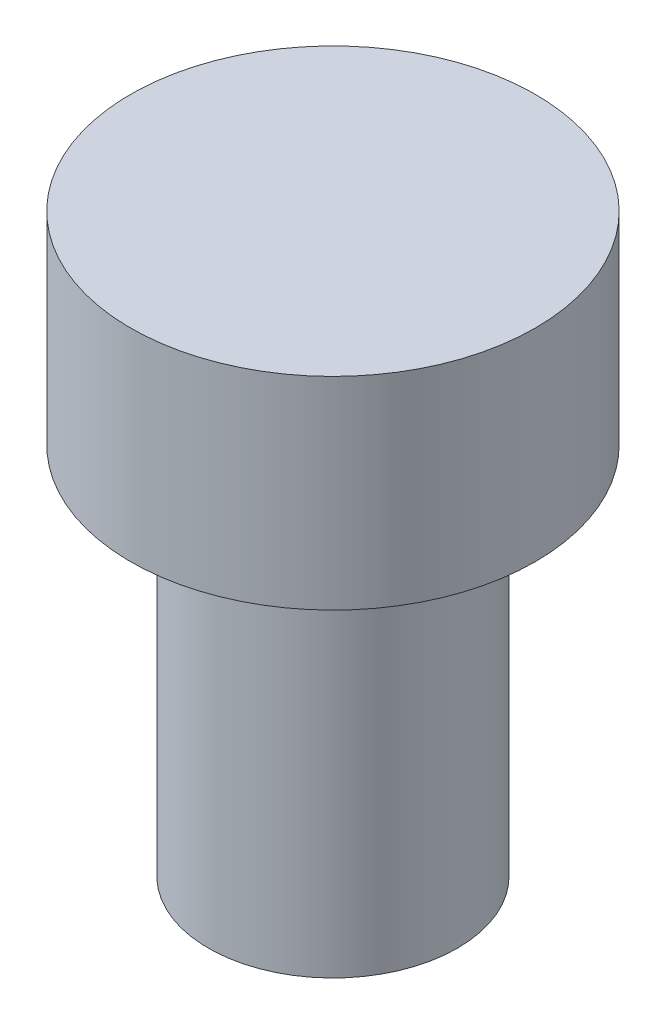
ISO-10303-21;
HEADER;
FILE_DESCRIPTION(('STEP AP214'),'2;1');
FILE_NAME('part.step','',(''),(''),'','','');
FILE_SCHEMA(('AUTOMOTIVE_DESIGN { 1 0 10303 214 1 1 1 1 }'));
ENDSEC;
DATA;
#1=APPLICATION_CONTEXT('core data for automotive mechanical design processes');
#2=APPLICATION_PROTOCOL_DEFINITION('international standard','automotive_design',2000,#1);
#3=PRODUCT_CONTEXT('',#1,'mechanical');
#4=PRODUCT('Part','Part','',(#3));
#5=PRODUCT_RELATED_PRODUCT_CATEGORY('part','',(#4));
#6=PRODUCT_DEFINITION_FORMATION('','',#4);
#7=PRODUCT_DEFINITION_CONTEXT('part definition',#1,'design');
#8=PRODUCT_DEFINITION('design','',#6,#7);
#9=PRODUCT_DEFINITION_SHAPE('','',#8);
#10=(LENGTH_UNIT() NAMED_UNIT(*) SI_UNIT(.MILLI.,.METRE.));
#11=(NAMED_UNIT(*) PLANE_ANGLE_UNIT() SI_UNIT($,.RADIAN.));
#12=(NAMED_UNIT(*) SI_UNIT($,.STERADIAN.) SOLID_ANGLE_UNIT());
#13=UNCERTAINTY_MEASURE_WITH_UNIT(LENGTH_MEASURE(1.E-05),#10,'distance_accuracy_value','');
#14=(GEOMETRIC_REPRESENTATION_CONTEXT(3) GLOBAL_UNCERTAINTY_ASSIGNED_CONTEXT((#13)) GLOBAL_UNIT_ASSIGNED_CONTEXT((#10,
#11,#12)) REPRESENTATION_CONTEXT('',''));
#15=CARTESIAN_POINT('',(0.,0.,0.));
#16=DIRECTION('',(0.,0.,1.));
#17=DIRECTION('',(1.,0.,0.));
#18=AXIS2_PLACEMENT_3D('',#15,#16,#17);
#19=CARTESIAN_POINT('',(757.5,-12.,515.));
#20=DIRECTION('',(0.,-1.,0.));
#21=DIRECTION('',(-1.,0.,0.));
#22=AXIS2_PLACEMENT_3D('',#19,#20,#21);
#23=CYLINDRICAL_SURFACE('',#22,16.);
#24=CARTESIAN_POINT('',(757.5,-12.,515.));
#25=DIRECTION('',(0.,1.,0.));
#26=DIRECTION('',(1.,0.,0.));
#27=AXIS2_PLACEMENT_3D('',#24,#25,#26);
#28=CIRCLE('',#27,16.);
#29=CARTESIAN_POINT('',(773.5,-12.,515.));
#30=VERTEX_POINT('',#29);
#31=EDGE_CURVE('E10',#30,#30,#28,.T.);
#32=ORIENTED_EDGE('',*,*,#31,.F.);
#33=EDGE_LOOP('',(#32));
#34=FACE_BOUND('',#33,.T.);
#35=CARTESIAN_POINT('',(757.5,-60.,515.));
#36=DIRECTION('',(0.,1.,0.));
#37=DIRECTION('',(1.,0.,0.));
#38=AXIS2_PLACEMENT_3D('',#35,#36,#37);
#39=CIRCLE('',#38,16.);
#40=CARTESIAN_POINT('',(773.5,-60.,515.));
#41=VERTEX_POINT('',#40);
#42=EDGE_CURVE('E42',#41,#41,#39,.T.);
#43=ORIENTED_EDGE('',*,*,#42,.T.);
#44=EDGE_LOOP('',(#43));
#45=FACE_BOUND('',#44,.T.);
#46=ADVANCED_FACE('F41',(#34,#45),#23,.T.);
#47=CARTESIAN_POINT('',(757.5,-60.,515.));
#48=DIRECTION('',(0.,1.,0.));
#49=DIRECTION('',(1.,0.,0.));
#50=AXIS2_PLACEMENT_3D('',#47,#48,#49);
#51=PLANE('',#50);
#52=ORIENTED_EDGE('',*,*,#42,.F.);
#53=EDGE_LOOP('',(#52));
#54=FACE_BOUND('',#53,.T.);
#55=ADVANCED_FACE('F65',(#54),#51,.F.);
#56=CARTESIAN_POINT('',(757.5,14.,515.));
#57=DIRECTION('',(0.,-1.,0.));
#58=DIRECTION('',(-1.,0.,0.));
#59=AXIS2_PLACEMENT_3D('',#56,#57,#58);
#60=CYLINDRICAL_SURFACE('',#59,26.);
#61=CARTESIAN_POINT('',(757.5,14.,515.));
#62=DIRECTION('',(0.,1.,0.));
#63=DIRECTION('',(1.,0.,0.));
#64=AXIS2_PLACEMENT_3D('',#61,#62,#63);
#65=CIRCLE('',#64,26.);
#66=CARTESIAN_POINT('',(783.5,14.,515.));
#67=VERTEX_POINT('',#66);
#68=EDGE_CURVE('E51',#67,#67,#65,.T.);
#69=ORIENTED_EDGE('',*,*,#68,.F.);
#70=EDGE_LOOP('',(#69));
#71=FACE_BOUND('',#70,.T.);
#72=CARTESIAN_POINT('',(757.5,-12.,515.));
#73=DIRECTION('',(0.,1.,0.));
#74=DIRECTION('',(1.,0.,0.));
#75=AXIS2_PLACEMENT_3D('',#72,#73,#74);
#76=CIRCLE('',#75,26.);
#77=CARTESIAN_POINT('',(783.5,-12.,515.));
#78=VERTEX_POINT('',#77);
#79=EDGE_CURVE('E52',#78,#78,#76,.T.);
#80=ORIENTED_EDGE('',*,*,#79,.T.);
#81=EDGE_LOOP('',(#80));
#82=FACE_BOUND('',#81,.T.);
#83=ADVANCED_FACE('F63',(#71,#82),#60,.T.);
#84=CARTESIAN_POINT('',(757.5,14.,515.));
#85=DIRECTION('',(0.,1.,0.));
#86=DIRECTION('',(1.,0.,0.));
#87=AXIS2_PLACEMENT_3D('',#84,#85,#86);
#88=PLANE('',#87);
#89=ORIENTED_EDGE('',*,*,#68,.T.);
#90=EDGE_LOOP('',(#89));
#91=FACE_BOUND('',#90,.T.);
#92=ADVANCED_FACE('F56',(#91),#88,.T.);
#93=CARTESIAN_POINT('',(757.5,-12.,515.));
#94=DIRECTION('',(0.,1.,0.));
#95=DIRECTION('',(1.,0.,0.));
#96=AXIS2_PLACEMENT_3D('',#93,#94,#95);
#97=PLANE('',#96);
#98=ORIENTED_EDGE('',*,*,#31,.T.);
#99=EDGE_LOOP('',(#98));
#100=FACE_BOUND('',#99,.T.);
#101=ORIENTED_EDGE('',*,*,#79,.F.);
#102=EDGE_LOOP('',(#101));
#103=FACE_BOUND('',#102,.T.);
#104=ADVANCED_FACE('F69',(#100,#103),#97,.F.);
#105=CLOSED_SHELL('',(#46,#55,#83,#92,#104));
#106=MANIFOLD_SOLID_BREP('B2',#105);
#107=ADVANCED_BREP_SHAPE_REPRESENTATION('',(#18,#106),#14);
#108=SHAPE_DEFINITION_REPRESENTATION(#9,#107);
ENDSEC;
END-ISO-10303-21;
